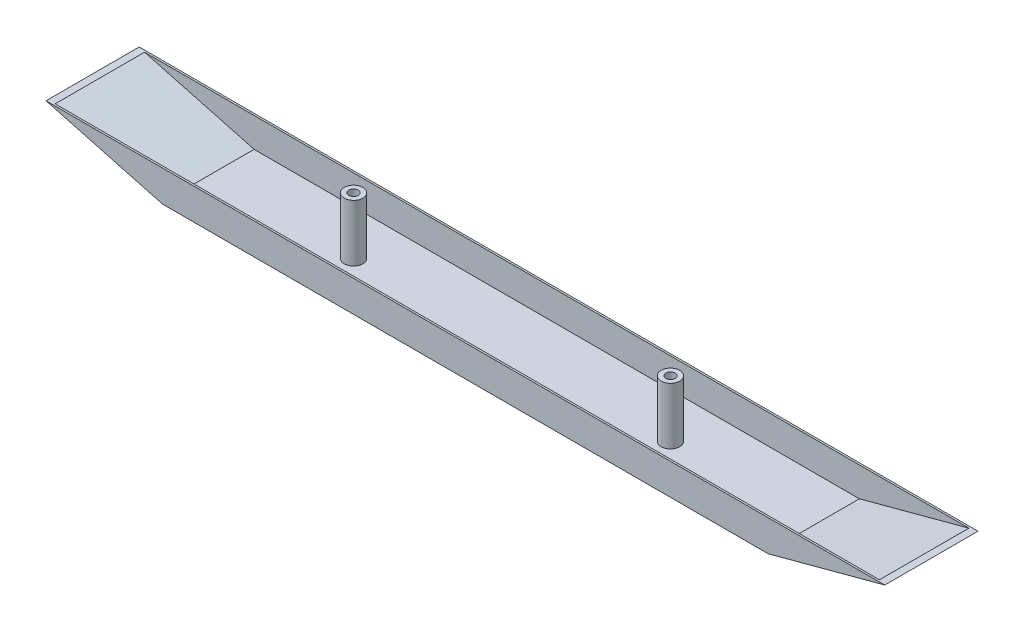
ISO-10303-21;
HEADER;
FILE_DESCRIPTION(('STEP AP214'),'2;1');
FILE_NAME('part.step','',(''),(''),'','','');
FILE_SCHEMA(('AUTOMOTIVE_DESIGN { 1 0 10303 214 1 1 1 1 }'));
ENDSEC;
DATA;
#1=APPLICATION_CONTEXT('core data for automotive mechanical design processes');
#2=APPLICATION_PROTOCOL_DEFINITION('international standard','automotive_design',2000,#1);
#3=PRODUCT_CONTEXT('',#1,'mechanical');
#4=PRODUCT('Part','Part','',(#3));
#5=PRODUCT_RELATED_PRODUCT_CATEGORY('part','',(#4));
#6=PRODUCT_DEFINITION_FORMATION('','',#4);
#7=PRODUCT_DEFINITION_CONTEXT('part definition',#1,'design');
#8=PRODUCT_DEFINITION('design','',#6,#7);
#9=PRODUCT_DEFINITION_SHAPE('','',#8);
#10=(LENGTH_UNIT() NAMED_UNIT(*) SI_UNIT(.MILLI.,.METRE.));
#11=(NAMED_UNIT(*) PLANE_ANGLE_UNIT() SI_UNIT($,.RADIAN.));
#12=(NAMED_UNIT(*) SI_UNIT($,.STERADIAN.) SOLID_ANGLE_UNIT());
#13=UNCERTAINTY_MEASURE_WITH_UNIT(LENGTH_MEASURE(1.E-05),#10,'distance_accuracy_value','');
#14=(GEOMETRIC_REPRESENTATION_CONTEXT(3) GLOBAL_UNCERTAINTY_ASSIGNED_CONTEXT((#13)) GLOBAL_UNIT_ASSIGNED_CONTEXT((#10,
#11,#12)) REPRESENTATION_CONTEXT('',''));
#15=CARTESIAN_POINT('',(0.,0.,0.));
#16=DIRECTION('',(0.,0.,1.));
#17=DIRECTION('',(1.,0.,0.));
#18=AXIS2_PLACEMENT_3D('',#15,#16,#17);
#19=CARTESIAN_POINT('',(-162.5,1.,50.));
#20=DIRECTION('',(0.,1.,0.));
#21=DIRECTION('',(0.,0.,1.));
#22=AXIS2_PLACEMENT_3D('',#19,#20,#21);
#23=PLANE('',#22);
#24=CARTESIAN_POINT('',(-85.,1.,25.));
#25=DIRECTION('',(0.,1.,0.));
#26=DIRECTION('',(0.,0.,1.));
#27=AXIS2_PLACEMENT_3D('',#24,#25,#26);
#28=CIRCLE('',#27,5.);
#29=CARTESIAN_POINT('',(-85.,0.999999999999997,20.));
#30=VERTEX_POINT('',#29);
#31=EDGE_CURVE('E263',#30,#30,#28,.T.);
#32=ORIENTED_EDGE('',*,*,#31,.F.);
#33=EDGE_LOOP('',(#32));
#34=FACE_BOUND('',#33,.T.);
#35=DIRECTION('',(1.,0.,0.));
#36=VECTOR('',#35,1.);
#37=CARTESIAN_POINT('',(-162.5,1.,1.));
#38=LINE('',#37,#36);
#39=CARTESIAN_POINT('',(-162.368347502413,1.,1.));
#40=VERTEX_POINT('',#39);
#41=CARTESIAN_POINT('',(162.368347502413,1.,1.));
#42=VERTEX_POINT('',#41);
#43=EDGE_CURVE('E108',#40,#42,#38,.T.);
#44=ORIENTED_EDGE('',*,*,#43,.F.);
#45=DIRECTION('',(0.,0.,-1.));
#46=VECTOR('',#45,1.);
#47=CARTESIAN_POINT('',(-162.368347502413,1.,50.));
#48=LINE('',#47,#46);
#49=CARTESIAN_POINT('',(-162.368347502413,1.,49.));
#50=VERTEX_POINT('',#49);
#51=EDGE_CURVE('E124',#50,#40,#48,.T.);
#52=ORIENTED_EDGE('',*,*,#51,.F.);
#53=DIRECTION('',(1.,0.,0.));
#54=VECTOR('',#53,1.);
#55=CARTESIAN_POINT('',(-162.5,1.,49.));
#56=LINE('',#55,#54);
#57=CARTESIAN_POINT('',(162.368347502413,1.,49.));
#58=VERTEX_POINT('',#57);
#59=EDGE_CURVE('E123',#50,#58,#56,.T.);
#60=ORIENTED_EDGE('',*,*,#59,.T.);
#61=DIRECTION('',(0.,0.,-1.));
#62=VECTOR('',#61,1.);
#63=CARTESIAN_POINT('',(162.368347502413,1.,50.));
#64=LINE('',#63,#62);
#65=EDGE_CURVE('E120',#58,#42,#64,.T.);
#66=ORIENTED_EDGE('',*,*,#65,.T.);
#67=EDGE_LOOP('',(#44,#52,#60,#66));
#68=FACE_BOUND('',#67,.T.);
#69=CARTESIAN_POINT('',(85.,1.,25.));
#70=DIRECTION('',(0.,1.,0.));
#71=DIRECTION('',(0.,0.,1.));
#72=AXIS2_PLACEMENT_3D('',#69,#70,#71);
#73=CIRCLE('',#72,5.);
#74=CARTESIAN_POINT('',(85.,0.999999999999997,20.));
#75=VERTEX_POINT('',#74);
#76=EDGE_CURVE('E254',#75,#75,#73,.T.);
#77=ORIENTED_EDGE('',*,*,#76,.F.);
#78=EDGE_LOOP('',(#77));
#79=FACE_BOUND('',#78,.T.);
#80=ADVANCED_FACE('F33',(#34,#68,#79),#23,.T.);
#81=CARTESIAN_POINT('',(-225.,16.7468245269452,50.));
#82=DIRECTION('',(0.,-1.,0.));
#83=DIRECTION('',(0.,0.,-1.));
#84=AXIS2_PLACEMENT_3D('',#81,#82,#83);
#85=PLANE('',#84);
#86=DIRECTION('',(-1.,0.,0.));
#87=VECTOR('',#86,1.);
#88=CARTESIAN_POINT('',(-225.,16.7468245269452,0.));
#89=LINE('',#88,#87);
#90=CARTESIAN_POINT('',(225.,16.7468245269452,0.));
#91=VERTEX_POINT('',#90);
#92=CARTESIAN_POINT('',(-225.,16.7468245269452,0.));
#93=VERTEX_POINT('',#92);
#94=EDGE_CURVE('E161',#91,#93,#89,.T.);
#95=ORIENTED_EDGE('',*,*,#94,.T.);
#96=DIRECTION('',(0.,0.,-1.));
#97=VECTOR('',#96,1.);
#98=CARTESIAN_POINT('',(-225.,16.7468245269452,50.));
#99=LINE('',#98,#97);
#100=CARTESIAN_POINT('',(-225.,16.7468245269452,50.));
#101=VERTEX_POINT('',#100);
#102=EDGE_CURVE('E41',#101,#93,#99,.T.);
#103=ORIENTED_EDGE('',*,*,#102,.F.);
#104=DIRECTION('',(-1.,0.,0.));
#105=VECTOR('',#104,1.);
#106=CARTESIAN_POINT('',(-225.,16.7468245269452,50.));
#107=LINE('',#106,#105);
#108=CARTESIAN_POINT('',(225.,16.7468245269452,50.));
#109=VERTEX_POINT('',#108);
#110=EDGE_CURVE('E85',#109,#101,#107,.T.);
#111=ORIENTED_EDGE('',*,*,#110,.F.);
#112=DIRECTION('',(0.,0.,-1.));
#113=VECTOR('',#112,1.);
#114=CARTESIAN_POINT('',(225.,16.7468245269452,50.));
#115=LINE('',#114,#113);
#116=EDGE_CURVE('E11',#109,#91,#115,.T.);
#117=ORIENTED_EDGE('',*,*,#116,.T.);
#118=EDGE_LOOP('',(#95,#103,#111,#117));
#119=FACE_BOUND('',#118,.T.);
#120=DIRECTION('',(-1.,0.,0.));
#121=VECTOR('',#120,1.);
#122=CARTESIAN_POINT('',(-225.,16.7468245269452,1.));
#123=LINE('',#122,#121);
#124=CARTESIAN_POINT('',(221.136296694844,16.7468245269452,1.));
#125=VERTEX_POINT('',#124);
#126=CARTESIAN_POINT('',(-221.136296694844,16.7468245269452,1.));
#127=VERTEX_POINT('',#126);
#128=EDGE_CURVE('E129',#125,#127,#123,.T.);
#129=ORIENTED_EDGE('',*,*,#128,.F.);
#130=DIRECTION('',(0.,0.,-1.));
#131=VECTOR('',#130,1.);
#132=CARTESIAN_POINT('',(221.136296694844,16.7468245269452,50.));
#133=LINE('',#132,#131);
#134=CARTESIAN_POINT('',(221.136296694844,16.7468245269452,49.));
#135=VERTEX_POINT('',#134);
#136=EDGE_CURVE('E128',#135,#125,#133,.T.);
#137=ORIENTED_EDGE('',*,*,#136,.F.);
#138=DIRECTION('',(-1.,0.,0.));
#139=VECTOR('',#138,1.);
#140=CARTESIAN_POINT('',(-225.,16.7468245269452,49.));
#141=LINE('',#140,#139);
#142=CARTESIAN_POINT('',(-221.136296694844,16.7468245269452,49.));
#143=VERTEX_POINT('',#142);
#144=EDGE_CURVE('E138',#135,#143,#141,.T.);
#145=ORIENTED_EDGE('',*,*,#144,.T.);
#146=DIRECTION('',(0.,0.,-1.));
#147=VECTOR('',#146,1.);
#148=CARTESIAN_POINT('',(-221.136296694844,16.7468245269452,50.));
#149=LINE('',#148,#147);
#150=EDGE_CURVE('E143',#143,#127,#149,.T.);
#151=ORIENTED_EDGE('',*,*,#150,.T.);
#152=EDGE_LOOP('',(#129,#137,#145,#151));
#153=FACE_BOUND('',#152,.T.);
#154=ADVANCED_FACE('F195',(#119,#153),#85,.F.);
#155=CARTESIAN_POINT('',(162.5,0.,50.));
#156=DIRECTION('',(-0.258819045102522,0.965925826289068,0.));
#157=DIRECTION('',(-0.965925826289068,-0.258819045102522,0.));
#158=AXIS2_PLACEMENT_3D('',#155,#156,#157);
#159=PLANE('',#158);
#160=DIRECTION('',(0.965925826289068,0.258819045102522,0.));
#161=VECTOR('',#160,1.);
#162=CARTESIAN_POINT('',(162.5,0.,0.));
#163=LINE('',#162,#161);
#164=CARTESIAN_POINT('',(162.5,0.,0.));
#165=VERTEX_POINT('',#164);
#166=EDGE_CURVE('E146',#165,#91,#163,.T.);
#167=ORIENTED_EDGE('',*,*,#166,.T.);
#168=ORIENTED_EDGE('',*,*,#116,.F.);
#169=DIRECTION('',(0.965925826289068,0.258819045102522,0.));
#170=VECTOR('',#169,1.);
#171=CARTESIAN_POINT('',(162.5,0.,50.));
#172=LINE('',#171,#170);
#173=CARTESIAN_POINT('',(162.5,0.,50.));
#174=VERTEX_POINT('',#173);
#175=EDGE_CURVE('E152',#174,#109,#172,.T.);
#176=ORIENTED_EDGE('',*,*,#175,.F.);
#177=DIRECTION('',(0.,0.,-1.));
#178=VECTOR('',#177,1.);
#179=CARTESIAN_POINT('',(162.5,0.,50.));
#180=LINE('',#179,#178);
#181=EDGE_CURVE('E158',#174,#165,#180,.T.);
#182=ORIENTED_EDGE('',*,*,#181,.T.);
#183=EDGE_LOOP('',(#167,#168,#176,#182));
#184=FACE_BOUND('',#183,.T.);
#185=ADVANCED_FACE('F35',(#184),#159,.F.);
#186=CARTESIAN_POINT('',(-162.5,0.,50.));
#187=DIRECTION('',(0.258819045102522,0.965925826289068,0.));
#188=DIRECTION('',(-0.965925826289068,0.258819045102522,0.));
#189=AXIS2_PLACEMENT_3D('',#186,#187,#188);
#190=PLANE('',#189);
#191=DIRECTION('',(0.965925826289068,-0.258819045102522,0.));
#192=VECTOR('',#191,1.);
#193=CARTESIAN_POINT('',(-162.5,0.,0.));
#194=LINE('',#193,#192);
#195=CARTESIAN_POINT('',(-162.5,0.,0.));
#196=VERTEX_POINT('',#195);
#197=EDGE_CURVE('E163',#93,#196,#194,.T.);
#198=ORIENTED_EDGE('',*,*,#197,.T.);
#199=DIRECTION('',(0.,0.,-1.));
#200=VECTOR('',#199,1.);
#201=CARTESIAN_POINT('',(-162.5,0.,50.));
#202=LINE('',#201,#200);
#203=CARTESIAN_POINT('',(-162.5,0.,50.));
#204=VERTEX_POINT('',#203);
#205=EDGE_CURVE('E167',#204,#196,#202,.T.);
#206=ORIENTED_EDGE('',*,*,#205,.F.);
#207=DIRECTION('',(0.965925826289068,-0.258819045102522,0.));
#208=VECTOR('',#207,1.);
#209=CARTESIAN_POINT('',(-162.5,0.,50.));
#210=LINE('',#209,#208);
#211=EDGE_CURVE('E155',#101,#204,#210,.T.);
#212=ORIENTED_EDGE('',*,*,#211,.F.);
#213=ORIENTED_EDGE('',*,*,#102,.T.);
#214=EDGE_LOOP('',(#198,#206,#212,#213));
#215=FACE_BOUND('',#214,.T.);
#216=ADVANCED_FACE('F172',(#215),#190,.F.);
#217=CARTESIAN_POINT('',(-162.5,0.,50.));
#218=DIRECTION('',(0.,1.,0.));
#219=DIRECTION('',(0.,0.,1.));
#220=AXIS2_PLACEMENT_3D('',#217,#218,#219);
#221=PLANE('',#220);
#222=CARTESIAN_POINT('',(85.,0.,25.));
#223=DIRECTION('',(0.,-1.,0.));
#224=DIRECTION('',(0.,0.,-1.));
#225=AXIS2_PLACEMENT_3D('',#222,#223,#224);
#226=CIRCLE('',#225,2.5);
#227=CARTESIAN_POINT('',(85.,0.,22.5));
#228=VERTEX_POINT('',#227);
#229=EDGE_CURVE('E134',#228,#228,#226,.T.);
#230=ORIENTED_EDGE('',*,*,#229,.F.);
#231=EDGE_LOOP('',(#230));
#232=FACE_BOUND('',#231,.T.);
#233=CARTESIAN_POINT('',(-85.,0.,25.));
#234=DIRECTION('',(0.,-1.,0.));
#235=DIRECTION('',(0.,0.,-1.));
#236=AXIS2_PLACEMENT_3D('',#233,#234,#235);
#237=CIRCLE('',#236,2.5);
#238=CARTESIAN_POINT('',(-85.,0.,22.5));
#239=VERTEX_POINT('',#238);
#240=EDGE_CURVE('E130',#239,#239,#237,.T.);
#241=ORIENTED_EDGE('',*,*,#240,.F.);
#242=EDGE_LOOP('',(#241));
#243=FACE_BOUND('',#242,.T.);
#244=DIRECTION('',(1.,0.,0.));
#245=VECTOR('',#244,1.);
#246=CARTESIAN_POINT('',(-162.5,0.,0.));
#247=LINE('',#246,#245);
#248=EDGE_CURVE('E78',#196,#165,#247,.T.);
#249=ORIENTED_EDGE('',*,*,#248,.T.);
#250=ORIENTED_EDGE('',*,*,#181,.F.);
#251=DIRECTION('',(1.,0.,0.));
#252=VECTOR('',#251,1.);
#253=CARTESIAN_POINT('',(-162.5,0.,50.));
#254=LINE('',#253,#252);
#255=EDGE_CURVE('E57',#204,#174,#254,.T.);
#256=ORIENTED_EDGE('',*,*,#255,.F.);
#257=ORIENTED_EDGE('',*,*,#205,.T.);
#258=EDGE_LOOP('',(#249,#250,#256,#257));
#259=FACE_BOUND('',#258,.T.);
#260=ADVANCED_FACE('F180',(#232,#243,#259),#221,.F.);
#261=CARTESIAN_POINT('',(0.,0.,50.));
#262=DIRECTION('',(0.,0.,1.));
#263=DIRECTION('',(1.,0.,0.));
#264=AXIS2_PLACEMENT_3D('',#261,#262,#263);
#265=PLANE('',#264);
#266=ORIENTED_EDGE('',*,*,#175,.T.);
#267=ORIENTED_EDGE('',*,*,#110,.T.);
#268=ORIENTED_EDGE('',*,*,#211,.T.);
#269=ORIENTED_EDGE('',*,*,#255,.T.);
#270=EDGE_LOOP('',(#266,#267,#268,#269));
#271=FACE_BOUND('',#270,.T.);
#272=ADVANCED_FACE('F182',(#271),#265,.T.);
#273=CARTESIAN_POINT('',(0.,0.,0.));
#274=DIRECTION('',(0.,0.,1.));
#275=DIRECTION('',(1.,0.,0.));
#276=AXIS2_PLACEMENT_3D('',#273,#274,#275);
#277=PLANE('',#276);
#278=ORIENTED_EDGE('',*,*,#166,.F.);
#279=ORIENTED_EDGE('',*,*,#248,.F.);
#280=ORIENTED_EDGE('',*,*,#197,.F.);
#281=ORIENTED_EDGE('',*,*,#94,.F.);
#282=EDGE_LOOP('',(#278,#279,#280,#281));
#283=FACE_BOUND('',#282,.T.);
#284=ADVANCED_FACE('F176',(#283),#277,.F.);
#285=CARTESIAN_POINT('',(162.241180954897,0.965925826289068,50.));
#286=DIRECTION('',(-0.258819045102522,0.965925826289068,0.));
#287=DIRECTION('',(-0.965925826289068,-0.258819045102522,0.));
#288=AXIS2_PLACEMENT_3D('',#285,#286,#287);
#289=PLANE('',#288);
#290=DIRECTION('',(0.965925826289068,0.258819045102522,0.));
#291=VECTOR('',#290,1.);
#292=CARTESIAN_POINT('',(162.241180954897,0.965925826289068,1.));
#293=LINE('',#292,#291);
#294=EDGE_CURVE('E112',#42,#125,#293,.T.);
#295=ORIENTED_EDGE('',*,*,#294,.F.);
#296=ORIENTED_EDGE('',*,*,#65,.F.);
#297=DIRECTION('',(0.965925826289068,0.258819045102522,0.));
#298=VECTOR('',#297,1.);
#299=CARTESIAN_POINT('',(162.241180954897,0.965925826289068,49.));
#300=LINE('',#299,#298);
#301=EDGE_CURVE('E48',#58,#135,#300,.T.);
#302=ORIENTED_EDGE('',*,*,#301,.T.);
#303=ORIENTED_EDGE('',*,*,#136,.T.);
#304=EDGE_LOOP('',(#295,#296,#302,#303));
#305=FACE_BOUND('',#304,.T.);
#306=ADVANCED_FACE('F126',(#305),#289,.T.);
#307=CARTESIAN_POINT('',(-162.241180954897,0.965925826289068,50.));
#308=DIRECTION('',(0.258819045102522,0.965925826289068,0.));
#309=DIRECTION('',(-0.965925826289068,0.258819045102522,0.));
#310=AXIS2_PLACEMENT_3D('',#307,#308,#309);
#311=PLANE('',#310);
#312=DIRECTION('',(0.965925826289068,-0.258819045102522,0.));
#313=VECTOR('',#312,1.);
#314=CARTESIAN_POINT('',(-162.241180954897,0.965925826289068,1.));
#315=LINE('',#314,#313);
#316=EDGE_CURVE('E115',#127,#40,#315,.T.);
#317=ORIENTED_EDGE('',*,*,#316,.F.);
#318=ORIENTED_EDGE('',*,*,#150,.F.);
#319=DIRECTION('',(0.965925826289068,-0.258819045102522,0.));
#320=VECTOR('',#319,1.);
#321=CARTESIAN_POINT('',(-162.241180954897,0.965925826289068,49.));
#322=LINE('',#321,#320);
#323=EDGE_CURVE('E141',#143,#50,#322,.T.);
#324=ORIENTED_EDGE('',*,*,#323,.T.);
#325=ORIENTED_EDGE('',*,*,#51,.T.);
#326=EDGE_LOOP('',(#317,#318,#324,#325));
#327=FACE_BOUND('',#326,.T.);
#328=ADVANCED_FACE('F205',(#327),#311,.T.);
#329=CARTESIAN_POINT('',(0.,0.,49.));
#330=DIRECTION('',(0.,0.,1.));
#331=DIRECTION('',(1.,0.,0.));
#332=AXIS2_PLACEMENT_3D('',#329,#330,#331);
#333=PLANE('',#332);
#334=ORIENTED_EDGE('',*,*,#301,.F.);
#335=ORIENTED_EDGE('',*,*,#59,.F.);
#336=ORIENTED_EDGE('',*,*,#323,.F.);
#337=ORIENTED_EDGE('',*,*,#144,.F.);
#338=EDGE_LOOP('',(#334,#335,#336,#337));
#339=FACE_BOUND('',#338,.T.);
#340=ADVANCED_FACE('F207',(#339),#333,.F.);
#341=CARTESIAN_POINT('',(0.,0.,1.));
#342=DIRECTION('',(0.,0.,1.));
#343=DIRECTION('',(1.,0.,0.));
#344=AXIS2_PLACEMENT_3D('',#341,#342,#343);
#345=PLANE('',#344);
#346=ORIENTED_EDGE('',*,*,#294,.T.);
#347=ORIENTED_EDGE('',*,*,#128,.T.);
#348=ORIENTED_EDGE('',*,*,#316,.T.);
#349=ORIENTED_EDGE('',*,*,#43,.T.);
#350=EDGE_LOOP('',(#346,#347,#348,#349));
#351=FACE_BOUND('',#350,.T.);
#352=ADVANCED_FACE('F110',(#351),#345,.T.);
#353=CARTESIAN_POINT('',(-85.,50.,25.));
#354=DIRECTION('',(0.,-1.,0.));
#355=DIRECTION('',(0.,0.,-1.));
#356=AXIS2_PLACEMENT_3D('',#353,#354,#355);
#357=CYLINDRICAL_SURFACE('',#356,2.5);
#358=ORIENTED_EDGE('',*,*,#240,.T.);
#359=EDGE_LOOP('',(#358));
#360=FACE_BOUND('',#359,.T.);
#361=CARTESIAN_POINT('',(-85.,31.5,25.));
#362=DIRECTION('',(0.,1.,0.));
#363=DIRECTION('',(0.,0.,1.));
#364=AXIS2_PLACEMENT_3D('',#361,#362,#363);
#365=CIRCLE('',#364,2.5);
#366=CARTESIAN_POINT('',(-85.,31.5,27.5));
#367=VERTEX_POINT('',#366);
#368=EDGE_CURVE('E259',#367,#367,#365,.T.);
#369=ORIENTED_EDGE('',*,*,#368,.T.);
#370=EDGE_LOOP('',(#369));
#371=FACE_BOUND('',#370,.T.);
#372=ADVANCED_FACE('F212',(#360,#371),#357,.F.);
#373=CARTESIAN_POINT('',(85.,50.,25.));
#374=DIRECTION('',(0.,-1.,0.));
#375=DIRECTION('',(0.,0.,-1.));
#376=AXIS2_PLACEMENT_3D('',#373,#374,#375);
#377=CYLINDRICAL_SURFACE('',#376,2.5);
#378=ORIENTED_EDGE('',*,*,#229,.T.);
#379=EDGE_LOOP('',(#378));
#380=FACE_BOUND('',#379,.T.);
#381=CARTESIAN_POINT('',(85.,31.5,25.));
#382=DIRECTION('',(0.,1.,0.));
#383=DIRECTION('',(0.,0.,1.));
#384=AXIS2_PLACEMENT_3D('',#381,#382,#383);
#385=CIRCLE('',#384,2.49999999999999);
#386=CARTESIAN_POINT('',(85.,31.5,27.5));
#387=VERTEX_POINT('',#386);
#388=EDGE_CURVE('E252',#387,#387,#385,.T.);
#389=ORIENTED_EDGE('',*,*,#388,.T.);
#390=EDGE_LOOP('',(#389));
#391=FACE_BOUND('',#390,.T.);
#392=ADVANCED_FACE('F224',(#380,#391),#377,.F.);
#393=CARTESIAN_POINT('',(-85.,31.5,25.));
#394=DIRECTION('',(0.,1.,0.));
#395=DIRECTION('',(0.,0.,1.));
#396=AXIS2_PLACEMENT_3D('',#393,#394,#395);
#397=PLANE('',#396);
#398=CARTESIAN_POINT('',(-85.,31.5,25.));
#399=DIRECTION('',(0.,1.,0.));
#400=DIRECTION('',(0.,0.,1.));
#401=AXIS2_PLACEMENT_3D('',#398,#399,#400);
#402=CIRCLE('',#401,5.);
#403=CARTESIAN_POINT('',(-85.,31.5,20.));
#404=VERTEX_POINT('',#403);
#405=EDGE_CURVE('E264',#404,#404,#402,.T.);
#406=ORIENTED_EDGE('',*,*,#405,.T.);
#407=EDGE_LOOP('',(#406));
#408=FACE_BOUND('',#407,.T.);
#409=ORIENTED_EDGE('',*,*,#368,.F.);
#410=EDGE_LOOP('',(#409));
#411=FACE_BOUND('',#410,.T.);
#412=ADVANCED_FACE('F228',(#408,#411),#397,.T.);
#413=CARTESIAN_POINT('',(-85.,31.5,25.));
#414=DIRECTION('',(0.,-1.,0.));
#415=DIRECTION('',(0.,0.,-1.));
#416=AXIS2_PLACEMENT_3D('',#413,#414,#415);
#417=CYLINDRICAL_SURFACE('',#416,5.);
#418=CARTESIAN_POINT('',(-85.,31.5,20.));
#419=CARTESIAN_POINT('',(-85.,31.1822916666667,20.));
#420=CARTESIAN_POINT('',(-85.,30.8645833333333,20.));
#421=CARTESIAN_POINT('',(-85.,30.2291666666667,20.));
#422=CARTESIAN_POINT('',(-85.,29.9114583333333,20.));
#423=CARTESIAN_POINT('',(-85.,29.2760416666667,20.));
#424=CARTESIAN_POINT('',(-85.,28.9583333333333,20.));
#425=CARTESIAN_POINT('',(-85.,28.3229166666667,20.));
#426=CARTESIAN_POINT('',(-85.,28.0052083333333,20.));
#427=CARTESIAN_POINT('',(-85.,27.3697916666667,20.));
#428=CARTESIAN_POINT('',(-85.,27.0520833333333,20.));
#429=CARTESIAN_POINT('',(-85.,26.4166666666667,20.));
#430=CARTESIAN_POINT('',(-85.,26.0989583333333,20.));
#431=CARTESIAN_POINT('',(-85.,25.4635416666667,20.));
#432=CARTESIAN_POINT('',(-85.,25.1458333333333,20.));
#433=CARTESIAN_POINT('',(-85.,24.5104166666667,20.));
#434=CARTESIAN_POINT('',(-85.,24.1927083333333,20.));
#435=CARTESIAN_POINT('',(-85.,23.5572916666667,20.));
#436=CARTESIAN_POINT('',(-85.,23.2395833333333,20.));
#437=CARTESIAN_POINT('',(-85.,22.6041666666667,20.));
#438=CARTESIAN_POINT('',(-85.,22.2864583333333,20.));
#439=CARTESIAN_POINT('',(-85.,21.6510416666667,20.));
#440=CARTESIAN_POINT('',(-85.,21.3333333333333,20.));
#441=CARTESIAN_POINT('',(-85.,20.6979166666667,20.));
#442=CARTESIAN_POINT('',(-85.,20.3802083333333,20.));
#443=CARTESIAN_POINT('',(-85.,19.7447916666667,20.));
#444=CARTESIAN_POINT('',(-85.,19.4270833333333,20.));
#445=CARTESIAN_POINT('',(-85.,18.7916666666667,20.));
#446=CARTESIAN_POINT('',(-85.,18.4739583333333,20.));
#447=CARTESIAN_POINT('',(-85.,17.8385416666667,20.));
#448=CARTESIAN_POINT('',(-85.,17.5208333333333,20.));
#449=CARTESIAN_POINT('',(-85.,16.8854166666667,20.));
#450=CARTESIAN_POINT('',(-85.,16.5677083333333,20.));
#451=CARTESIAN_POINT('',(-85.,15.9322916666667,20.));
#452=CARTESIAN_POINT('',(-85.,15.6145833333333,20.));
#453=CARTESIAN_POINT('',(-85.,14.9791666666667,20.));
#454=CARTESIAN_POINT('',(-85.,14.6614583333333,20.));
#455=CARTESIAN_POINT('',(-85.,14.0260416666667,20.));
#456=CARTESIAN_POINT('',(-85.,13.7083333333333,20.));
#457=CARTESIAN_POINT('',(-85.,13.0729166666667,20.));
#458=CARTESIAN_POINT('',(-85.,12.7552083333333,20.));
#459=CARTESIAN_POINT('',(-85.,12.1197916666667,20.));
#460=CARTESIAN_POINT('',(-85.,11.8020833333333,20.));
#461=CARTESIAN_POINT('',(-85.,11.1666666666667,20.));
#462=CARTESIAN_POINT('',(-85.,10.8489583333333,20.));
#463=CARTESIAN_POINT('',(-85.,10.2135416666667,20.));
#464=CARTESIAN_POINT('',(-85.,9.89583333333333,20.));
#465=CARTESIAN_POINT('',(-85.,9.26041666666666,20.));
#466=CARTESIAN_POINT('',(-85.,8.94270833333333,20.));
#467=CARTESIAN_POINT('',(-85.,8.30729166666666,20.));
#468=CARTESIAN_POINT('',(-85.,7.98958333333333,20.));
#469=CARTESIAN_POINT('',(-85.,7.35416666666667,20.));
#470=CARTESIAN_POINT('',(-85.,7.03645833333333,20.));
#471=CARTESIAN_POINT('',(-85.,6.40104166666667,20.));
#472=CARTESIAN_POINT('',(-85.,6.08333333333333,20.));
#473=CARTESIAN_POINT('',(-85.,5.44791666666666,20.));
#474=CARTESIAN_POINT('',(-85.,5.13020833333333,20.));
#475=CARTESIAN_POINT('',(-85.,4.49479166666666,20.));
#476=CARTESIAN_POINT('',(-85.,4.17708333333333,20.));
#477=CARTESIAN_POINT('',(-85.,3.54166666666667,20.));
#478=CARTESIAN_POINT('',(-85.,3.22395833333333,20.));
#479=CARTESIAN_POINT('',(-85.,2.58854166666667,20.));
#480=CARTESIAN_POINT('',(-85.,2.27083333333333,20.));
#481=CARTESIAN_POINT('',(-85.,1.63541666666666,20.));
#482=CARTESIAN_POINT('',(-85.,1.31770833333333,20.));
#483=CARTESIAN_POINT('',(-85.,0.999999999999997,20.));
#484=B_SPLINE_CURVE_WITH_KNOTS('',3,(#418,#419,#420,#421,#422,#423,#424,#425,#426,#427,#428,
#429,#430,#431,#432,#433,#434,#435,#436,#437,#438,#439,#440,#441,#442,#443,#444,#445,#446,#447,
#448,#449,#450,#451,#452,#453,#454,#455,#456,#457,#458,#459,#460,#461,#462,#463,#464,#465,#466,
#467,#468,#469,#470,#471,#472,#473,#474,#475,#476,#477,#478,#479,#480,#481,#482,#483),
.UNSPECIFIED.,.F.,.F.,(4,2,2,2,2,2,2,2,2,2,2,2,2,2,2,2,2,2,2,2,2,2,2,2,2,2,2,2,2,2,2,2,4),(0.,
0.953125000000003,1.90625000000001,2.859375,3.8125,4.765625,5.71875,6.671875,7.625,8.578125,
9.53125000000001,10.484375,11.4375,12.390625,13.34375,14.296875,15.25,16.203125,17.15625,
18.109375,19.0625,20.015625,20.96875,21.921875,22.875,23.828125,24.78125,25.734375,26.6875,
27.640625,28.59375,29.546875,30.5),.UNSPECIFIED.);
#485=EDGE_CURVE('BSEAM230',#404,#30,#484,.T.);
#486=ORIENTED_EDGE('',*,*,#405,.F.);
#487=ORIENTED_EDGE('',*,*,#31,.T.);
#488=ORIENTED_EDGE('',*,*,#485,.T.);
#489=ORIENTED_EDGE('',*,*,#485,.F.);
#490=EDGE_LOOP('',(#486,#488,#487,#489));
#491=FACE_BOUND('',#490,.T.);
#492=ADVANCED_FACE('F230',(#491),#417,.T.);
#493=CARTESIAN_POINT('',(85.,31.5,25.));
#494=DIRECTION('',(0.,1.,0.));
#495=DIRECTION('',(0.,0.,1.));
#496=AXIS2_PLACEMENT_3D('',#493,#494,#495);
#497=PLANE('',#496);
#498=CARTESIAN_POINT('',(85.,31.5,25.));
#499=DIRECTION('',(0.,1.,0.));
#500=DIRECTION('',(0.,0.,1.));
#501=AXIS2_PLACEMENT_3D('',#498,#499,#500);
#502=CIRCLE('',#501,5.);
#503=CARTESIAN_POINT('',(85.,31.5,20.));
#504=VERTEX_POINT('',#503);
#505=EDGE_CURVE('E249',#504,#504,#502,.T.);
#506=ORIENTED_EDGE('',*,*,#505,.T.);
#507=EDGE_LOOP('',(#506));
#508=FACE_BOUND('',#507,.T.);
#509=ORIENTED_EDGE('',*,*,#388,.F.);
#510=EDGE_LOOP('',(#509));
#511=FACE_BOUND('',#510,.T.);
#512=ADVANCED_FACE('F233',(#508,#511),#497,.T.);
#513=CARTESIAN_POINT('',(85.,31.5,25.));
#514=DIRECTION('',(0.,-1.,0.));
#515=DIRECTION('',(0.,0.,-1.));
#516=AXIS2_PLACEMENT_3D('',#513,#514,#515);
#517=CYLINDRICAL_SURFACE('',#516,5.);
#518=CARTESIAN_POINT('',(85.,31.5,20.));
#519=CARTESIAN_POINT('',(85.,31.1822916666667,20.));
#520=CARTESIAN_POINT('',(85.,30.8645833333333,20.));
#521=CARTESIAN_POINT('',(85.,30.2291666666667,20.));
#522=CARTESIAN_POINT('',(85.,29.9114583333333,20.));
#523=CARTESIAN_POINT('',(85.,29.2760416666667,20.));
#524=CARTESIAN_POINT('',(85.,28.9583333333333,20.));
#525=CARTESIAN_POINT('',(85.,28.3229166666667,20.));
#526=CARTESIAN_POINT('',(85.,28.0052083333333,20.));
#527=CARTESIAN_POINT('',(85.,27.3697916666667,20.));
#528=CARTESIAN_POINT('',(85.,27.0520833333333,20.));
#529=CARTESIAN_POINT('',(85.,26.4166666666667,20.));
#530=CARTESIAN_POINT('',(85.,26.0989583333333,20.));
#531=CARTESIAN_POINT('',(85.,25.4635416666667,20.));
#532=CARTESIAN_POINT('',(85.,25.1458333333333,20.));
#533=CARTESIAN_POINT('',(85.,24.5104166666667,20.));
#534=CARTESIAN_POINT('',(85.,24.1927083333333,20.));
#535=CARTESIAN_POINT('',(85.,23.5572916666667,20.));
#536=CARTESIAN_POINT('',(85.,23.2395833333333,20.));
#537=CARTESIAN_POINT('',(85.,22.6041666666667,20.));
#538=CARTESIAN_POINT('',(85.,22.2864583333333,20.));
#539=CARTESIAN_POINT('',(85.,21.6510416666667,20.));
#540=CARTESIAN_POINT('',(85.,21.3333333333333,20.));
#541=CARTESIAN_POINT('',(85.,20.6979166666667,20.));
#542=CARTESIAN_POINT('',(85.,20.3802083333333,20.));
#543=CARTESIAN_POINT('',(85.,19.7447916666667,20.));
#544=CARTESIAN_POINT('',(85.,19.4270833333333,20.));
#545=CARTESIAN_POINT('',(85.,18.7916666666667,20.));
#546=CARTESIAN_POINT('',(85.,18.4739583333333,20.));
#547=CARTESIAN_POINT('',(85.,17.8385416666667,20.));
#548=CARTESIAN_POINT('',(85.,17.5208333333333,20.));
#549=CARTESIAN_POINT('',(85.,16.8854166666667,20.));
#550=CARTESIAN_POINT('',(85.,16.5677083333333,20.));
#551=CARTESIAN_POINT('',(85.,15.9322916666667,20.));
#552=CARTESIAN_POINT('',(85.,15.6145833333333,20.));
#553=CARTESIAN_POINT('',(85.,14.9791666666667,20.));
#554=CARTESIAN_POINT('',(85.,14.6614583333333,20.));
#555=CARTESIAN_POINT('',(85.,14.0260416666667,20.));
#556=CARTESIAN_POINT('',(85.,13.7083333333333,20.));
#557=CARTESIAN_POINT('',(85.,13.0729166666667,20.));
#558=CARTESIAN_POINT('',(85.,12.7552083333333,20.));
#559=CARTESIAN_POINT('',(85.,12.1197916666667,20.));
#560=CARTESIAN_POINT('',(85.,11.8020833333333,20.));
#561=CARTESIAN_POINT('',(85.,11.1666666666667,20.));
#562=CARTESIAN_POINT('',(85.,10.8489583333333,20.));
#563=CARTESIAN_POINT('',(85.,10.2135416666667,20.));
#564=CARTESIAN_POINT('',(85.,9.89583333333333,20.));
#565=CARTESIAN_POINT('',(85.,9.26041666666666,20.));
#566=CARTESIAN_POINT('',(85.,8.94270833333333,20.));
#567=CARTESIAN_POINT('',(85.,8.30729166666666,20.));
#568=CARTESIAN_POINT('',(85.,7.98958333333333,20.));
#569=CARTESIAN_POINT('',(85.,7.35416666666667,20.));
#570=CARTESIAN_POINT('',(85.,7.03645833333333,20.));
#571=CARTESIAN_POINT('',(85.,6.40104166666667,20.));
#572=CARTESIAN_POINT('',(85.,6.08333333333333,20.));
#573=CARTESIAN_POINT('',(85.,5.44791666666666,20.));
#574=CARTESIAN_POINT('',(85.,5.13020833333333,20.));
#575=CARTESIAN_POINT('',(85.,4.49479166666666,20.));
#576=CARTESIAN_POINT('',(85.,4.17708333333333,20.));
#577=CARTESIAN_POINT('',(85.,3.54166666666667,20.));
#578=CARTESIAN_POINT('',(85.,3.22395833333333,20.));
#579=CARTESIAN_POINT('',(85.,2.58854166666667,20.));
#580=CARTESIAN_POINT('',(85.,2.27083333333333,20.));
#581=CARTESIAN_POINT('',(85.,1.63541666666666,20.));
#582=CARTESIAN_POINT('',(85.,1.31770833333333,20.));
#583=CARTESIAN_POINT('',(85.,0.999999999999997,20.));
#584=B_SPLINE_CURVE_WITH_KNOTS('',3,(#518,#519,#520,#521,#522,#523,#524,#525,#526,#527,#528,
#529,#530,#531,#532,#533,#534,#535,#536,#537,#538,#539,#540,#541,#542,#543,#544,#545,#546,#547,
#548,#549,#550,#551,#552,#553,#554,#555,#556,#557,#558,#559,#560,#561,#562,#563,#564,#565,#566,
#567,#568,#569,#570,#571,#572,#573,#574,#575,#576,#577,#578,#579,#580,#581,#582,#583),
.UNSPECIFIED.,.F.,.F.,(4,2,2,2,2,2,2,2,2,2,2,2,2,2,2,2,2,2,2,2,2,2,2,2,2,2,2,2,2,2,2,2,4),(0.,
0.953125000000003,1.90625000000001,2.859375,3.8125,4.765625,5.71875,6.671875,7.625,8.578125,
9.53125000000001,10.484375,11.4375,12.390625,13.34375,14.296875,15.25,16.203125,17.15625,
18.109375,19.0625,20.015625,20.96875,21.921875,22.875,23.828125,24.78125,25.734375,26.6875,
27.640625,28.59375,29.546875,30.5),.UNSPECIFIED.);
#585=EDGE_CURVE('BSEAM238',#504,#75,#584,.T.);
#586=ORIENTED_EDGE('',*,*,#505,.F.);
#587=ORIENTED_EDGE('',*,*,#76,.T.);
#588=ORIENTED_EDGE('',*,*,#585,.T.);
#589=ORIENTED_EDGE('',*,*,#585,.F.);
#590=EDGE_LOOP('',(#586,#588,#587,#589));
#591=FACE_BOUND('',#590,.T.);
#592=ADVANCED_FACE('F238',(#591),#517,.T.);
#593=CLOSED_SHELL('',(#80,#154,#185,#216,#260,#272,#284,#306,#328,#340,#352,#372,#392,#412,#492,
#512,#592));
#594=MANIFOLD_SOLID_BREP('B2',#593);
#595=ADVANCED_BREP_SHAPE_REPRESENTATION('',(#18,#594),#14);
#596=SHAPE_DEFINITION_REPRESENTATION(#9,#595);
ENDSEC;
END-ISO-10303-21;
